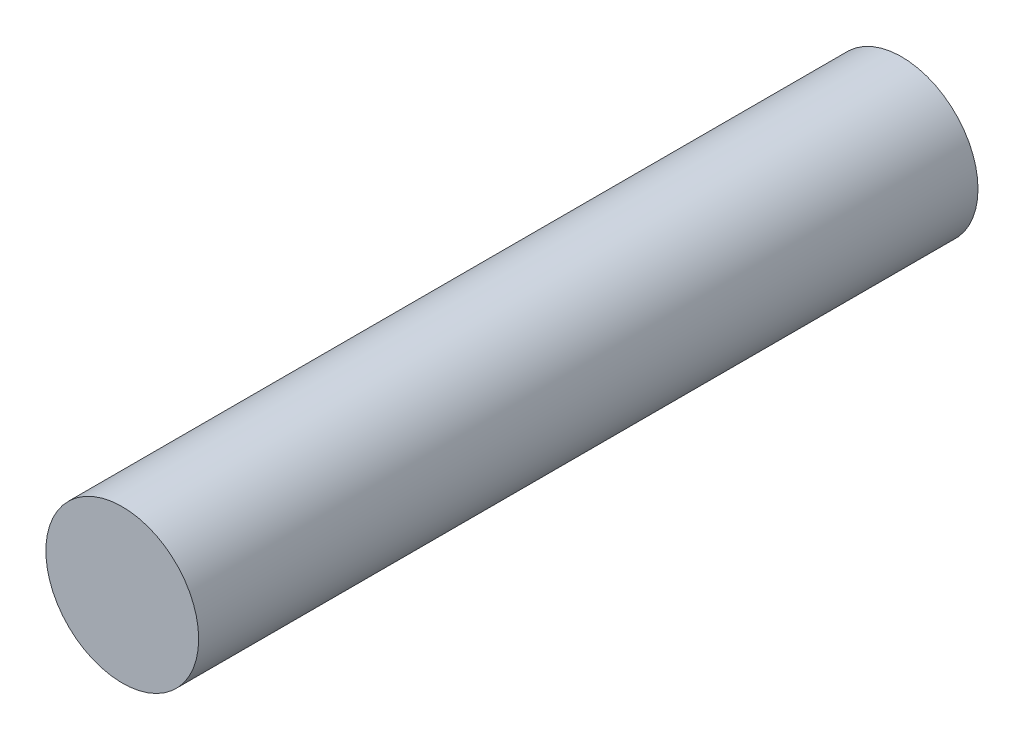
ISO-10303-21;
HEADER;
FILE_DESCRIPTION(('STEP AP214'),'2;1');
FILE_NAME('part.step','',(''),(''),'','','');
FILE_SCHEMA(('AUTOMOTIVE_DESIGN { 1 0 10303 214 1 1 1 1 }'));
ENDSEC;
DATA;
#1=APPLICATION_CONTEXT('core data for automotive mechanical design processes');
#2=APPLICATION_PROTOCOL_DEFINITION('international standard','automotive_design',2000,#1);
#3=PRODUCT_CONTEXT('',#1,'mechanical');
#4=PRODUCT('Part','Part','',(#3));
#5=PRODUCT_RELATED_PRODUCT_CATEGORY('part','',(#4));
#6=PRODUCT_DEFINITION_FORMATION('','',#4);
#7=PRODUCT_DEFINITION_CONTEXT('part definition',#1,'design');
#8=PRODUCT_DEFINITION('design','',#6,#7);
#9=PRODUCT_DEFINITION_SHAPE('','',#8);
#10=(LENGTH_UNIT() NAMED_UNIT(*) SI_UNIT(.MILLI.,.METRE.));
#11=(NAMED_UNIT(*) PLANE_ANGLE_UNIT() SI_UNIT($,.RADIAN.));
#12=(NAMED_UNIT(*) SI_UNIT($,.STERADIAN.) SOLID_ANGLE_UNIT());
#13=UNCERTAINTY_MEASURE_WITH_UNIT(LENGTH_MEASURE(1.E-05),#10,'distance_accuracy_value','');
#14=(GEOMETRIC_REPRESENTATION_CONTEXT(3) GLOBAL_UNCERTAINTY_ASSIGNED_CONTEXT((#13)) GLOBAL_UNIT_ASSIGNED_CONTEXT((#10,
#11,#12)) REPRESENTATION_CONTEXT('',''));
#15=CARTESIAN_POINT('',(0.,0.,0.));
#16=DIRECTION('',(0.,0.,1.));
#17=DIRECTION('',(1.,0.,0.));
#18=AXIS2_PLACEMENT_3D('',#15,#16,#17);
#19=CARTESIAN_POINT('',(0.,0.,-765.));
#20=DIRECTION('',(0.,0.,1.));
#21=DIRECTION('',(1.,0.,0.));
#22=AXIS2_PLACEMENT_3D('',#19,#20,#21);
#23=CYLINDRICAL_SURFACE('',#22,75.);
#24=CARTESIAN_POINT('',(0.,0.,-765.));
#25=DIRECTION('',(0.,0.,1.));
#26=DIRECTION('',(1.,0.,0.));
#27=AXIS2_PLACEMENT_3D('',#24,#25,#26);
#28=CIRCLE('',#27,75.);
#29=CARTESIAN_POINT('',(75.,0.,-765.));
#30=VERTEX_POINT('',#29);
#31=EDGE_CURVE('E10',#30,#30,#28,.T.);
#32=ORIENTED_EDGE('',*,*,#31,.T.);
#33=EDGE_LOOP('',(#32));
#34=FACE_BOUND('',#33,.T.);
#35=CARTESIAN_POINT('',(0.,0.,0.));
#36=DIRECTION('',(0.,0.,1.));
#37=DIRECTION('',(1.,0.,0.));
#38=AXIS2_PLACEMENT_3D('',#35,#36,#37);
#39=CIRCLE('',#38,75.);
#40=CARTESIAN_POINT('',(75.,0.,0.));
#41=VERTEX_POINT('',#40);
#42=EDGE_CURVE('E40',#41,#41,#39,.T.);
#43=ORIENTED_EDGE('',*,*,#42,.F.);
#44=EDGE_LOOP('',(#43));
#45=FACE_BOUND('',#44,.T.);
#46=ADVANCED_FACE('F37',(#34,#45),#23,.T.);
#47=CARTESIAN_POINT('',(0.,0.,-765.));
#48=DIRECTION('',(0.,0.,1.));
#49=DIRECTION('',(1.,0.,0.));
#50=AXIS2_PLACEMENT_3D('',#47,#48,#49);
#51=PLANE('',#50);
#52=ORIENTED_EDGE('',*,*,#31,.F.);
#53=EDGE_LOOP('',(#52));
#54=FACE_BOUND('',#53,.T.);
#55=ADVANCED_FACE('F54',(#54),#51,.F.);
#56=CARTESIAN_POINT('',(0.,0.,0.));
#57=DIRECTION('',(0.,0.,1.));
#58=DIRECTION('',(1.,0.,0.));
#59=AXIS2_PLACEMENT_3D('',#56,#57,#58);
#60=PLANE('',#59);
#61=ORIENTED_EDGE('',*,*,#42,.T.);
#62=EDGE_LOOP('',(#61));
#63=FACE_BOUND('',#62,.T.);
#64=ADVANCED_FACE('F51',(#63),#60,.T.);
#65=CLOSED_SHELL('',(#46,#55,#64));
#66=MANIFOLD_SOLID_BREP('B2',#65);
#67=ADVANCED_BREP_SHAPE_REPRESENTATION('',(#18,#66),#14);
#68=SHAPE_DEFINITION_REPRESENTATION(#9,#67);
ENDSEC;
END-ISO-10303-21;
